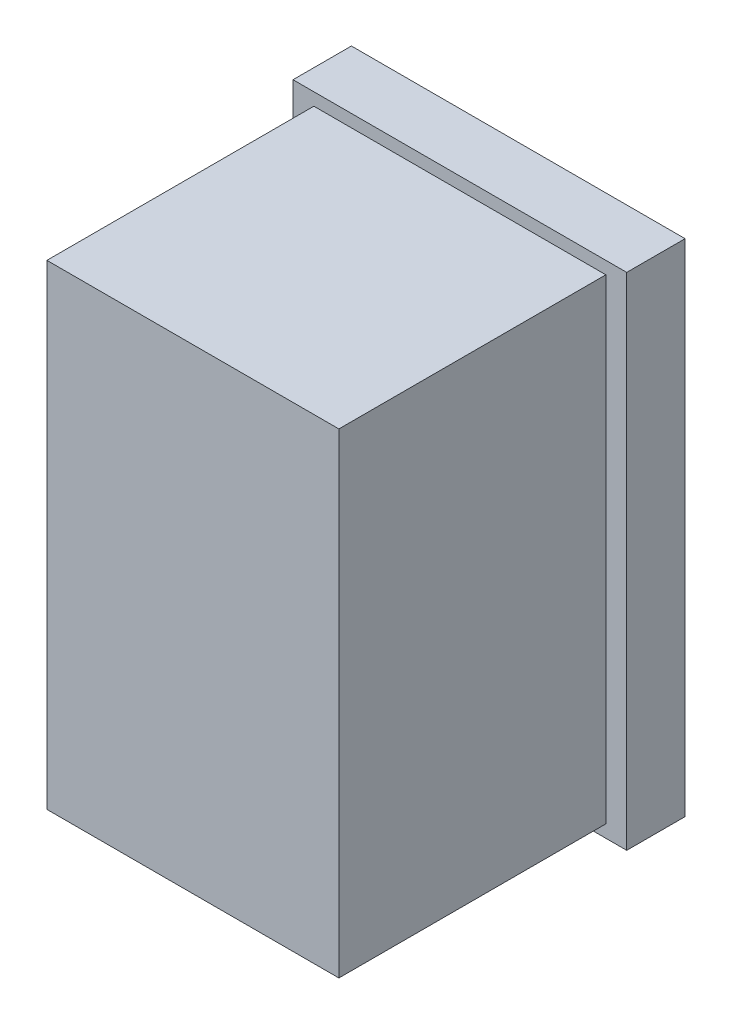
ISO-10303-21;
HEADER;
FILE_DESCRIPTION(('STEP AP214'),'2;1');
FILE_NAME('part.step','',(''),(''),'','','');
FILE_SCHEMA(('AUTOMOTIVE_DESIGN { 1 0 10303 214 1 1 1 1 }'));
ENDSEC;
DATA;
#1=APPLICATION_CONTEXT('core data for automotive mechanical design processes');
#2=APPLICATION_PROTOCOL_DEFINITION('international standard','automotive_design',2000,#1);
#3=PRODUCT_CONTEXT('',#1,'mechanical');
#4=PRODUCT('Part','Part','',(#3));
#5=PRODUCT_RELATED_PRODUCT_CATEGORY('part','',(#4));
#6=PRODUCT_DEFINITION_FORMATION('','',#4);
#7=PRODUCT_DEFINITION_CONTEXT('part definition',#1,'design');
#8=PRODUCT_DEFINITION('design','',#6,#7);
#9=PRODUCT_DEFINITION_SHAPE('','',#8);
#10=(LENGTH_UNIT() NAMED_UNIT(*) SI_UNIT(.MILLI.,.METRE.));
#11=(NAMED_UNIT(*) PLANE_ANGLE_UNIT() SI_UNIT($,.RADIAN.));
#12=(NAMED_UNIT(*) SI_UNIT($,.STERADIAN.) SOLID_ANGLE_UNIT());
#13=UNCERTAINTY_MEASURE_WITH_UNIT(LENGTH_MEASURE(1.E-05),#10,'distance_accuracy_value','');
#14=(GEOMETRIC_REPRESENTATION_CONTEXT(3) GLOBAL_UNCERTAINTY_ASSIGNED_CONTEXT((#13)) GLOBAL_UNIT_ASSIGNED_CONTEXT((#10,
#11,#12)) REPRESENTATION_CONTEXT('',''));
#15=CARTESIAN_POINT('',(0.,0.,0.));
#16=DIRECTION('',(0.,0.,1.));
#17=DIRECTION('',(1.,0.,0.));
#18=AXIS2_PLACEMENT_3D('',#15,#16,#17);
#19=CARTESIAN_POINT('',(4.445,7.239,8.128));
#20=DIRECTION('',(-1.,0.,0.));
#21=DIRECTION('',(0.,-1.,0.));
#22=AXIS2_PLACEMENT_3D('',#19,#20,#21);
#23=PLANE('',#22);
#24=DIRECTION('',(0.,1.,0.));
#25=VECTOR('',#24,1.);
#26=CARTESIAN_POINT('',(4.445,7.239,0.));
#27=LINE('',#26,#25);
#28=CARTESIAN_POINT('',(4.445,-7.239,0.));
#29=VERTEX_POINT('',#28);
#30=CARTESIAN_POINT('',(4.445,7.239,0.));
#31=VERTEX_POINT('',#30);
#32=EDGE_CURVE('E132',#29,#31,#27,.T.);
#33=ORIENTED_EDGE('',*,*,#32,.T.);
#34=DIRECTION('',(0.,0.,-1.));
#35=VECTOR('',#34,1.);
#36=CARTESIAN_POINT('',(4.445,7.239,8.128));
#37=LINE('',#36,#35);
#38=CARTESIAN_POINT('',(4.445,7.239,8.128));
#39=VERTEX_POINT('',#38);
#40=EDGE_CURVE('E11',#39,#31,#37,.T.);
#41=ORIENTED_EDGE('',*,*,#40,.F.);
#42=DIRECTION('',(0.,1.,0.));
#43=VECTOR('',#42,1.);
#44=CARTESIAN_POINT('',(4.445,7.239,8.128));
#45=LINE('',#44,#43);
#46=CARTESIAN_POINT('',(4.445,-7.239,8.128));
#47=VERTEX_POINT('',#46);
#48=EDGE_CURVE('E144',#47,#39,#45,.T.);
#49=ORIENTED_EDGE('',*,*,#48,.F.);
#50=DIRECTION('',(0.,0.,-1.));
#51=VECTOR('',#50,1.);
#52=CARTESIAN_POINT('',(4.445,-7.239,8.128));
#53=LINE('',#52,#51);
#54=EDGE_CURVE('E155',#47,#29,#53,.T.);
#55=ORIENTED_EDGE('',*,*,#54,.T.);
#56=EDGE_LOOP('',(#33,#41,#49,#55));
#57=FACE_BOUND('',#56,.T.);
#58=ADVANCED_FACE('F43',(#57),#23,.F.);
#59=CARTESIAN_POINT('',(-4.445,7.239,8.128));
#60=DIRECTION('',(0.,-1.,0.));
#61=DIRECTION('',(0.,0.,-1.));
#62=AXIS2_PLACEMENT_3D('',#59,#60,#61);
#63=PLANE('',#62);
#64=DIRECTION('',(-1.,0.,0.));
#65=VECTOR('',#64,1.);
#66=CARTESIAN_POINT('',(-4.445,7.239,0.));
#67=LINE('',#66,#65);
#68=CARTESIAN_POINT('',(-4.445,7.239,0.));
#69=VERTEX_POINT('',#68);
#70=EDGE_CURVE('E138',#31,#69,#67,.T.);
#71=ORIENTED_EDGE('',*,*,#70,.T.);
#72=DIRECTION('',(0.,0.,-1.));
#73=VECTOR('',#72,1.);
#74=CARTESIAN_POINT('',(-4.445,7.239,8.128));
#75=LINE('',#74,#73);
#76=CARTESIAN_POINT('',(-4.445,7.239,8.128));
#77=VERTEX_POINT('',#76);
#78=EDGE_CURVE('E52',#77,#69,#75,.T.);
#79=ORIENTED_EDGE('',*,*,#78,.F.);
#80=DIRECTION('',(-1.,0.,0.));
#81=VECTOR('',#80,1.);
#82=CARTESIAN_POINT('',(-4.445,7.239,8.128));
#83=LINE('',#82,#81);
#84=EDGE_CURVE('E147',#39,#77,#83,.T.);
#85=ORIENTED_EDGE('',*,*,#84,.F.);
#86=ORIENTED_EDGE('',*,*,#40,.T.);
#87=EDGE_LOOP('',(#71,#79,#85,#86));
#88=FACE_BOUND('',#87,.T.);
#89=ADVANCED_FACE('F183',(#88),#63,.F.);
#90=CARTESIAN_POINT('',(-4.445,7.239,8.128));
#91=DIRECTION('',(1.,0.,0.));
#92=DIRECTION('',(0.,1.,0.));
#93=AXIS2_PLACEMENT_3D('',#90,#91,#92);
#94=PLANE('',#93);
#95=DIRECTION('',(0.,-1.,0.));
#96=VECTOR('',#95,1.);
#97=CARTESIAN_POINT('',(-4.445,7.239,0.));
#98=LINE('',#97,#96);
#99=CARTESIAN_POINT('',(-4.445,-7.239,0.));
#100=VERTEX_POINT('',#99);
#101=EDGE_CURVE('E160',#69,#100,#98,.T.);
#102=ORIENTED_EDGE('',*,*,#101,.T.);
#103=DIRECTION('',(0.,0.,-1.));
#104=VECTOR('',#103,1.);
#105=CARTESIAN_POINT('',(-4.445,-7.239,8.128));
#106=LINE('',#105,#104);
#107=CARTESIAN_POINT('',(-4.445,-7.239,8.128));
#108=VERTEX_POINT('',#107);
#109=EDGE_CURVE('E170',#108,#100,#106,.T.);
#110=ORIENTED_EDGE('',*,*,#109,.F.);
#111=DIRECTION('',(0.,-1.,0.));
#112=VECTOR('',#111,1.);
#113=CARTESIAN_POINT('',(-4.445,7.239,8.128));
#114=LINE('',#113,#112);
#115=EDGE_CURVE('E151',#77,#108,#114,.T.);
#116=ORIENTED_EDGE('',*,*,#115,.F.);
#117=ORIENTED_EDGE('',*,*,#78,.T.);
#118=EDGE_LOOP('',(#102,#110,#116,#117));
#119=FACE_BOUND('',#118,.T.);
#120=ADVANCED_FACE('F179',(#119),#94,.F.);
#121=CARTESIAN_POINT('',(-4.445,-7.239,8.128));
#122=DIRECTION('',(0.,1.,0.));
#123=DIRECTION('',(0.,0.,1.));
#124=AXIS2_PLACEMENT_3D('',#121,#122,#123);
#125=PLANE('',#124);
#126=DIRECTION('',(1.,0.,0.));
#127=VECTOR('',#126,1.);
#128=CARTESIAN_POINT('',(-4.445,-7.239,0.));
#129=LINE('',#128,#127);
#130=EDGE_CURVE('E148',#100,#29,#129,.T.);
#131=ORIENTED_EDGE('',*,*,#130,.T.);
#132=ORIENTED_EDGE('',*,*,#54,.F.);
#133=DIRECTION('',(1.,0.,0.));
#134=VECTOR('',#133,1.);
#135=CARTESIAN_POINT('',(-4.445,-7.239,8.128));
#136=LINE('',#135,#134);
#137=EDGE_CURVE('E59',#108,#47,#136,.T.);
#138=ORIENTED_EDGE('',*,*,#137,.F.);
#139=ORIENTED_EDGE('',*,*,#109,.T.);
#140=EDGE_LOOP('',(#131,#132,#138,#139));
#141=FACE_BOUND('',#140,.T.);
#142=ADVANCED_FACE('F189',(#141),#125,.F.);
#143=CARTESIAN_POINT('',(0.,0.,8.128));
#144=DIRECTION('',(0.,0.,1.));
#145=DIRECTION('',(1.,0.,0.));
#146=AXIS2_PLACEMENT_3D('',#143,#144,#145);
#147=PLANE('',#146);
#148=ORIENTED_EDGE('',*,*,#48,.T.);
#149=ORIENTED_EDGE('',*,*,#84,.T.);
#150=ORIENTED_EDGE('',*,*,#115,.T.);
#151=ORIENTED_EDGE('',*,*,#137,.T.);
#152=EDGE_LOOP('',(#148,#149,#150,#151));
#153=FACE_BOUND('',#152,.T.);
#154=ADVANCED_FACE('F192',(#153),#147,.T.);
#155=CARTESIAN_POINT('',(-5.08,7.62,-1.778));
#156=DIRECTION('',(1.,0.,0.));
#157=DIRECTION('',(0.,1.,0.));
#158=AXIS2_PLACEMENT_3D('',#155,#156,#157);
#159=PLANE('',#158);
#160=DIRECTION('',(0.,1.,0.));
#161=VECTOR('',#160,1.);
#162=CARTESIAN_POINT('',(-5.08,7.62,0.));
#163=LINE('',#162,#161);
#164=CARTESIAN_POINT('',(-5.08,-7.62,0.));
#165=VERTEX_POINT('',#164);
#166=CARTESIAN_POINT('',(-5.08,7.62,0.));
#167=VERTEX_POINT('',#166);
#168=EDGE_CURVE('E130',#165,#167,#163,.T.);
#169=ORIENTED_EDGE('',*,*,#168,.T.);
#170=DIRECTION('',(0.,0.,1.));
#171=VECTOR('',#170,1.);
#172=CARTESIAN_POINT('',(-5.08,7.62,-1.778));
#173=LINE('',#172,#171);
#174=CARTESIAN_POINT('',(-5.08,7.62,-1.778));
#175=VERTEX_POINT('',#174);
#176=EDGE_CURVE('E108',#175,#167,#173,.T.);
#177=ORIENTED_EDGE('',*,*,#176,.F.);
#178=DIRECTION('',(0.,1.,0.));
#179=VECTOR('',#178,1.);
#180=CARTESIAN_POINT('',(-5.08,7.62,-1.778));
#181=LINE('',#180,#179);
#182=CARTESIAN_POINT('',(-5.08,-7.62,-1.778));
#183=VERTEX_POINT('',#182);
#184=EDGE_CURVE('E116',#183,#175,#181,.T.);
#185=ORIENTED_EDGE('',*,*,#184,.F.);
#186=DIRECTION('',(0.,0.,1.));
#187=VECTOR('',#186,1.);
#188=CARTESIAN_POINT('',(-5.08,-7.62,-1.778));
#189=LINE('',#188,#187);
#190=EDGE_CURVE('E285',#183,#165,#189,.T.);
#191=ORIENTED_EDGE('',*,*,#190,.T.);
#192=EDGE_LOOP('',(#169,#177,#185,#191));
#193=FACE_BOUND('',#192,.T.);
#194=ADVANCED_FACE('F128',(#193),#159,.F.);
#195=CARTESIAN_POINT('',(5.08,7.62,-1.778));
#196=DIRECTION('',(0.,-1.,0.));
#197=DIRECTION('',(0.,0.,-1.));
#198=AXIS2_PLACEMENT_3D('',#195,#196,#197);
#199=PLANE('',#198);
#200=DIRECTION('',(1.,0.,0.));
#201=VECTOR('',#200,1.);
#202=CARTESIAN_POINT('',(5.08,7.62,0.));
#203=LINE('',#202,#201);
#204=CARTESIAN_POINT('',(5.08,7.62,0.));
#205=VERTEX_POINT('',#204);
#206=EDGE_CURVE('E293',#167,#205,#203,.T.);
#207=ORIENTED_EDGE('',*,*,#206,.T.);
#208=DIRECTION('',(0.,0.,1.));
#209=VECTOR('',#208,1.);
#210=CARTESIAN_POINT('',(5.08,7.62,-1.778));
#211=LINE('',#210,#209);
#212=CARTESIAN_POINT('',(5.08,7.62,-1.778));
#213=VERTEX_POINT('',#212);
#214=EDGE_CURVE('E111',#213,#205,#211,.T.);
#215=ORIENTED_EDGE('',*,*,#214,.F.);
#216=DIRECTION('',(1.,0.,0.));
#217=VECTOR('',#216,1.);
#218=CARTESIAN_POINT('',(5.08,7.62,-1.778));
#219=LINE('',#218,#217);
#220=EDGE_CURVE('E104',#175,#213,#219,.T.);
#221=ORIENTED_EDGE('',*,*,#220,.F.);
#222=ORIENTED_EDGE('',*,*,#176,.T.);
#223=EDGE_LOOP('',(#207,#215,#221,#222));
#224=FACE_BOUND('',#223,.T.);
#225=ADVANCED_FACE('F106',(#224),#199,.F.);
#226=CARTESIAN_POINT('',(5.08,7.62,-1.778));
#227=DIRECTION('',(-1.,0.,0.));
#228=DIRECTION('',(0.,-1.,0.));
#229=AXIS2_PLACEMENT_3D('',#226,#227,#228);
#230=PLANE('',#229);
#231=DIRECTION('',(0.,-1.,0.));
#232=VECTOR('',#231,1.);
#233=CARTESIAN_POINT('',(5.08,7.62,0.));
#234=LINE('',#233,#232);
#235=CARTESIAN_POINT('',(5.08,-7.62,0.));
#236=VERTEX_POINT('',#235);
#237=EDGE_CURVE('E289',#205,#236,#234,.T.);
#238=ORIENTED_EDGE('',*,*,#237,.T.);
#239=DIRECTION('',(0.,0.,1.));
#240=VECTOR('',#239,1.);
#241=CARTESIAN_POINT('',(5.08,-7.62,-1.778));
#242=LINE('',#241,#240);
#243=CARTESIAN_POINT('',(5.08,-7.62,-1.778));
#244=VERTEX_POINT('',#243);
#245=EDGE_CURVE('E140',#244,#236,#242,.T.);
#246=ORIENTED_EDGE('',*,*,#245,.F.);
#247=DIRECTION('',(0.,-1.,0.));
#248=VECTOR('',#247,1.);
#249=CARTESIAN_POINT('',(5.08,7.62,-1.778));
#250=LINE('',#249,#248);
#251=EDGE_CURVE('E115',#213,#244,#250,.T.);
#252=ORIENTED_EDGE('',*,*,#251,.F.);
#253=ORIENTED_EDGE('',*,*,#214,.T.);
#254=EDGE_LOOP('',(#238,#246,#252,#253));
#255=FACE_BOUND('',#254,.T.);
#256=ADVANCED_FACE('F228',(#255),#230,.F.);
#257=CARTESIAN_POINT('',(5.08,-7.62,-1.778));
#258=DIRECTION('',(0.,1.,0.));
#259=DIRECTION('',(0.,0.,1.));
#260=AXIS2_PLACEMENT_3D('',#257,#258,#259);
#261=PLANE('',#260);
#262=DIRECTION('',(-1.,0.,0.));
#263=VECTOR('',#262,1.);
#264=CARTESIAN_POINT('',(5.08,-7.62,0.));
#265=LINE('',#264,#263);
#266=EDGE_CURVE('E126',#236,#165,#265,.T.);
#267=ORIENTED_EDGE('',*,*,#266,.T.);
#268=ORIENTED_EDGE('',*,*,#190,.F.);
#269=DIRECTION('',(-1.,0.,0.));
#270=VECTOR('',#269,1.);
#271=CARTESIAN_POINT('',(5.08,-7.62,-1.778));
#272=LINE('',#271,#270);
#273=EDGE_CURVE('E121',#244,#183,#272,.T.);
#274=ORIENTED_EDGE('',*,*,#273,.F.);
#275=ORIENTED_EDGE('',*,*,#245,.T.);
#276=EDGE_LOOP('',(#267,#268,#274,#275));
#277=FACE_BOUND('',#276,.T.);
#278=ADVANCED_FACE('F236',(#277),#261,.F.);
#279=CARTESIAN_POINT('',(0.,0.,-1.778));
#280=DIRECTION('',(0.,0.,-1.));
#281=DIRECTION('',(-1.,0.,0.));
#282=AXIS2_PLACEMENT_3D('',#279,#280,#281);
#283=PLANE('',#282);
#284=ORIENTED_EDGE('',*,*,#184,.T.);
#285=ORIENTED_EDGE('',*,*,#220,.T.);
#286=ORIENTED_EDGE('',*,*,#251,.T.);
#287=ORIENTED_EDGE('',*,*,#273,.T.);
#288=EDGE_LOOP('',(#284,#285,#286,#287));
#289=FACE_BOUND('',#288,.T.);
#290=ADVANCED_FACE('F119',(#289),#283,.T.);
#291=CARTESIAN_POINT('',(0.,0.,0.));
#292=DIRECTION('',(0.,0.,-1.));
#293=DIRECTION('',(-1.,0.,0.));
#294=AXIS2_PLACEMENT_3D('',#291,#292,#293);
#295=PLANE('',#294);
#296=ORIENTED_EDGE('',*,*,#32,.F.);
#297=ORIENTED_EDGE('',*,*,#130,.F.);
#298=ORIENTED_EDGE('',*,*,#101,.F.);
#299=ORIENTED_EDGE('',*,*,#70,.F.);
#300=EDGE_LOOP('',(#296,#297,#298,#299));
#301=FACE_BOUND('',#300,.T.);
#302=ORIENTED_EDGE('',*,*,#168,.F.);
#303=ORIENTED_EDGE('',*,*,#266,.F.);
#304=ORIENTED_EDGE('',*,*,#237,.F.);
#305=ORIENTED_EDGE('',*,*,#206,.F.);
#306=EDGE_LOOP('',(#302,#303,#304,#305));
#307=FACE_BOUND('',#306,.T.);
#308=ADVANCED_FACE('F186',(#301,#307),#295,.F.);
#309=CLOSED_SHELL('',(#58,#89,#120,#142,#154,#194,#225,#256,#278,#290,#308));
#310=MANIFOLD_SOLID_BREP('B2',#309);
#311=ADVANCED_BREP_SHAPE_REPRESENTATION('',(#18,#310),#14);
#312=SHAPE_DEFINITION_REPRESENTATION(#9,#311);
ENDSEC;
END-ISO-10303-21;
